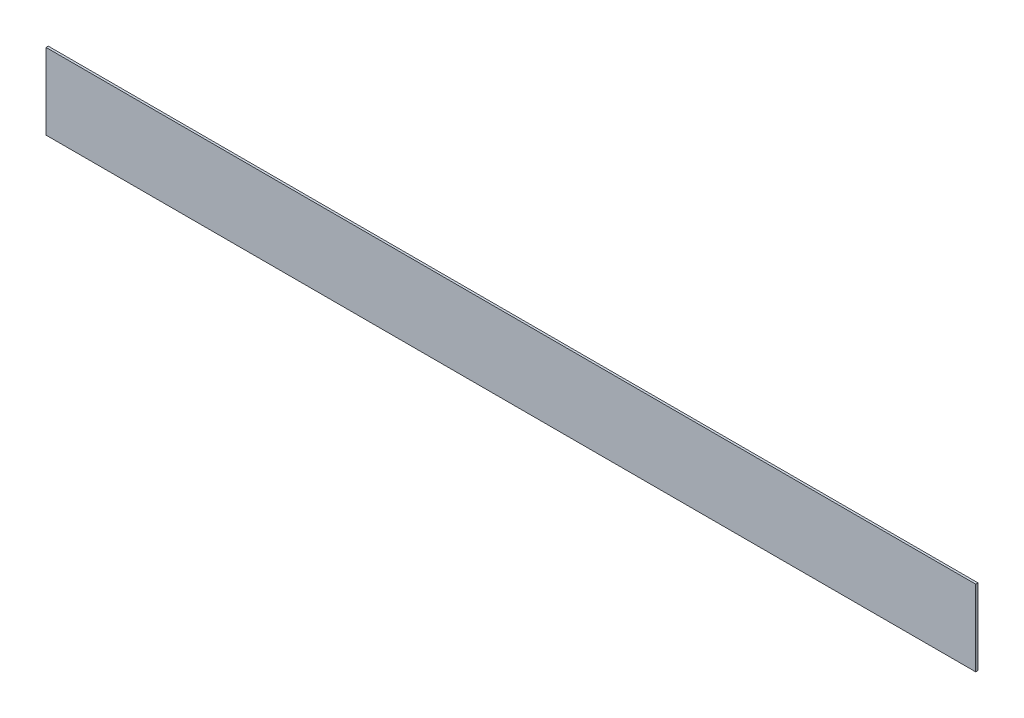
ISO-10303-21;
HEADER;
FILE_DESCRIPTION(('STEP AP214'),'2;1');
FILE_NAME('part.step','',(''),(''),'','','');
FILE_SCHEMA(('AUTOMOTIVE_DESIGN { 1 0 10303 214 1 1 1 1 }'));
ENDSEC;
DATA;
#1=APPLICATION_CONTEXT('core data for automotive mechanical design processes');
#2=APPLICATION_PROTOCOL_DEFINITION('international standard','automotive_design',2000,#1);
#3=PRODUCT_CONTEXT('',#1,'mechanical');
#4=PRODUCT('Part','Part','',(#3));
#5=PRODUCT_RELATED_PRODUCT_CATEGORY('part','',(#4));
#6=PRODUCT_DEFINITION_FORMATION('','',#4);
#7=PRODUCT_DEFINITION_CONTEXT('part definition',#1,'design');
#8=PRODUCT_DEFINITION('design','',#6,#7);
#9=PRODUCT_DEFINITION_SHAPE('','',#8);
#10=(LENGTH_UNIT() NAMED_UNIT(*) SI_UNIT(.MILLI.,.METRE.));
#11=(NAMED_UNIT(*) PLANE_ANGLE_UNIT() SI_UNIT($,.RADIAN.));
#12=(NAMED_UNIT(*) SI_UNIT($,.STERADIAN.) SOLID_ANGLE_UNIT());
#13=UNCERTAINTY_MEASURE_WITH_UNIT(LENGTH_MEASURE(1.E-05),#10,'distance_accuracy_value','');
#14=(GEOMETRIC_REPRESENTATION_CONTEXT(3) GLOBAL_UNCERTAINTY_ASSIGNED_CONTEXT((#13)) GLOBAL_UNIT_ASSIGNED_CONTEXT((#10,
#11,#12)) REPRESENTATION_CONTEXT('',''));
#15=CARTESIAN_POINT('',(0.,0.,0.));
#16=DIRECTION('',(0.,0.,1.));
#17=DIRECTION('',(1.,0.,0.));
#18=AXIS2_PLACEMENT_3D('',#15,#16,#17);
#19=CARTESIAN_POINT('',(0.,0.,5.));
#20=DIRECTION('',(1.,0.,0.));
#21=DIRECTION('',(0.,0.,-1.));
#22=AXIS2_PLACEMENT_3D('',#19,#20,#21);
#23=PLANE('',#22);
#24=DIRECTION('',(0.,-1.,0.));
#25=VECTOR('',#24,1.);
#26=CARTESIAN_POINT('',(0.,0.,0.));
#27=LINE('',#26,#25);
#28=CARTESIAN_POINT('',(0.,168.,0.));
#29=VERTEX_POINT('',#28);
#30=CARTESIAN_POINT('',(0.,0.,0.));
#31=VERTEX_POINT('',#30);
#32=EDGE_CURVE('E97',#29,#31,#27,.T.);
#33=ORIENTED_EDGE('',*,*,#32,.T.);
#34=DIRECTION('',(0.,0.,-1.));
#35=VECTOR('',#34,1.);
#36=CARTESIAN_POINT('',(0.,0.,5.));
#37=LINE('',#36,#35);
#38=CARTESIAN_POINT('',(0.,0.,5.));
#39=VERTEX_POINT('',#38);
#40=EDGE_CURVE('E11',#39,#31,#37,.T.);
#41=ORIENTED_EDGE('',*,*,#40,.F.);
#42=DIRECTION('',(0.,-1.,0.));
#43=VECTOR('',#42,1.);
#44=CARTESIAN_POINT('',(0.,0.,5.));
#45=LINE('',#44,#43);
#46=CARTESIAN_POINT('',(0.,168.,5.));
#47=VERTEX_POINT('',#46);
#48=EDGE_CURVE('E85',#47,#39,#45,.T.);
#49=ORIENTED_EDGE('',*,*,#48,.F.);
#50=DIRECTION('',(0.,0.,-1.));
#51=VECTOR('',#50,1.);
#52=CARTESIAN_POINT('',(0.,168.,5.));
#53=LINE('',#52,#51);
#54=EDGE_CURVE('E93',#47,#29,#53,.T.);
#55=ORIENTED_EDGE('',*,*,#54,.T.);
#56=EDGE_LOOP('',(#33,#41,#49,#55));
#57=FACE_BOUND('',#56,.T.);
#58=ADVANCED_FACE('F34',(#57),#23,.F.);
#59=CARTESIAN_POINT('',(0.,0.,5.));
#60=DIRECTION('',(0.,1.,0.));
#61=DIRECTION('',(0.,0.,1.));
#62=AXIS2_PLACEMENT_3D('',#59,#60,#61);
#63=PLANE('',#62);
#64=DIRECTION('',(1.,0.,0.));
#65=VECTOR('',#64,1.);
#66=CARTESIAN_POINT('',(0.,0.,0.));
#67=LINE('',#66,#65);
#68=CARTESIAN_POINT('',(2056.,0.,0.));
#69=VERTEX_POINT('',#68);
#70=EDGE_CURVE('E89',#31,#69,#67,.T.);
#71=ORIENTED_EDGE('',*,*,#70,.T.);
#72=DIRECTION('',(0.,0.,-1.));
#73=VECTOR('',#72,1.);
#74=CARTESIAN_POINT('',(2056.,0.,5.));
#75=LINE('',#74,#73);
#76=CARTESIAN_POINT('',(2056.,0.,5.));
#77=VERTEX_POINT('',#76);
#78=EDGE_CURVE('E42',#77,#69,#75,.T.);
#79=ORIENTED_EDGE('',*,*,#78,.F.);
#80=DIRECTION('',(1.,0.,0.));
#81=VECTOR('',#80,1.);
#82=CARTESIAN_POINT('',(0.,0.,5.));
#83=LINE('',#82,#81);
#84=EDGE_CURVE('E80',#39,#77,#83,.T.);
#85=ORIENTED_EDGE('',*,*,#84,.F.);
#86=ORIENTED_EDGE('',*,*,#40,.T.);
#87=EDGE_LOOP('',(#71,#79,#85,#86));
#88=FACE_BOUND('',#87,.T.);
#89=ADVANCED_FACE('F88',(#88),#63,.F.);
#90=CARTESIAN_POINT('',(2056.,0.,5.));
#91=DIRECTION('',(-1.,0.,0.));
#92=DIRECTION('',(0.,0.,1.));
#93=AXIS2_PLACEMENT_3D('',#90,#91,#92);
#94=PLANE('',#93);
#95=DIRECTION('',(0.,1.,0.));
#96=VECTOR('',#95,1.);
#97=CARTESIAN_POINT('',(2056.,0.,0.));
#98=LINE('',#97,#96);
#99=CARTESIAN_POINT('',(2056.,168.,0.));
#100=VERTEX_POINT('',#99);
#101=EDGE_CURVE('E67',#69,#100,#98,.T.);
#102=ORIENTED_EDGE('',*,*,#101,.T.);
#103=DIRECTION('',(0.,0.,-1.));
#104=VECTOR('',#103,1.);
#105=CARTESIAN_POINT('',(2056.,168.,5.));
#106=LINE('',#105,#104);
#107=CARTESIAN_POINT('',(2056.,168.,5.));
#108=VERTEX_POINT('',#107);
#109=EDGE_CURVE('E90',#108,#100,#106,.T.);
#110=ORIENTED_EDGE('',*,*,#109,.F.);
#111=DIRECTION('',(0.,1.,0.));
#112=VECTOR('',#111,1.);
#113=CARTESIAN_POINT('',(2056.,0.,5.));
#114=LINE('',#113,#112);
#115=EDGE_CURVE('E83',#77,#108,#114,.T.);
#116=ORIENTED_EDGE('',*,*,#115,.F.);
#117=ORIENTED_EDGE('',*,*,#78,.T.);
#118=EDGE_LOOP('',(#102,#110,#116,#117));
#119=FACE_BOUND('',#118,.T.);
#120=ADVANCED_FACE('F91',(#119),#94,.F.);
#121=CARTESIAN_POINT('',(0.,168.,5.));
#122=DIRECTION('',(0.,-1.,0.));
#123=DIRECTION('',(0.,0.,-1.));
#124=AXIS2_PLACEMENT_3D('',#121,#122,#123);
#125=PLANE('',#124);
#126=DIRECTION('',(-1.,0.,0.));
#127=VECTOR('',#126,1.);
#128=CARTESIAN_POINT('',(0.,168.,0.));
#129=LINE('',#128,#127);
#130=EDGE_CURVE('E73',#100,#29,#129,.T.);
#131=ORIENTED_EDGE('',*,*,#130,.T.);
#132=ORIENTED_EDGE('',*,*,#54,.F.);
#133=DIRECTION('',(-1.,0.,0.));
#134=VECTOR('',#133,1.);
#135=CARTESIAN_POINT('',(0.,168.,5.));
#136=LINE('',#135,#134);
#137=EDGE_CURVE('E50',#108,#47,#136,.T.);
#138=ORIENTED_EDGE('',*,*,#137,.F.);
#139=ORIENTED_EDGE('',*,*,#109,.T.);
#140=EDGE_LOOP('',(#131,#132,#138,#139));
#141=FACE_BOUND('',#140,.T.);
#142=ADVANCED_FACE('F104',(#141),#125,.F.);
#143=CARTESIAN_POINT('',(0.,0.,5.));
#144=DIRECTION('',(0.,0.,-1.));
#145=DIRECTION('',(-1.,0.,0.));
#146=AXIS2_PLACEMENT_3D('',#143,#144,#145);
#147=PLANE('',#146);
#148=ORIENTED_EDGE('',*,*,#48,.T.);
#149=ORIENTED_EDGE('',*,*,#84,.T.);
#150=ORIENTED_EDGE('',*,*,#115,.T.);
#151=ORIENTED_EDGE('',*,*,#137,.T.);
#152=EDGE_LOOP('',(#148,#149,#150,#151));
#153=FACE_BOUND('',#152,.T.);
#154=ADVANCED_FACE('F81',(#153),#147,.F.);
#155=CARTESIAN_POINT('',(0.,0.,0.));
#156=DIRECTION('',(0.,0.,-1.));
#157=DIRECTION('',(-1.,0.,0.));
#158=AXIS2_PLACEMENT_3D('',#155,#156,#157);
#159=PLANE('',#158);
#160=ORIENTED_EDGE('',*,*,#32,.F.);
#161=ORIENTED_EDGE('',*,*,#130,.F.);
#162=ORIENTED_EDGE('',*,*,#101,.F.);
#163=ORIENTED_EDGE('',*,*,#70,.F.);
#164=EDGE_LOOP('',(#160,#161,#162,#163));
#165=FACE_BOUND('',#164,.T.);
#166=ADVANCED_FACE('F107',(#165),#159,.T.);
#167=CLOSED_SHELL('',(#58,#89,#120,#142,#154,#166));
#168=MANIFOLD_SOLID_BREP('B2',#167);
#169=ADVANCED_BREP_SHAPE_REPRESENTATION('',(#18,#168),#14);
#170=SHAPE_DEFINITION_REPRESENTATION(#9,#169);
ENDSEC;
END-ISO-10303-21;
